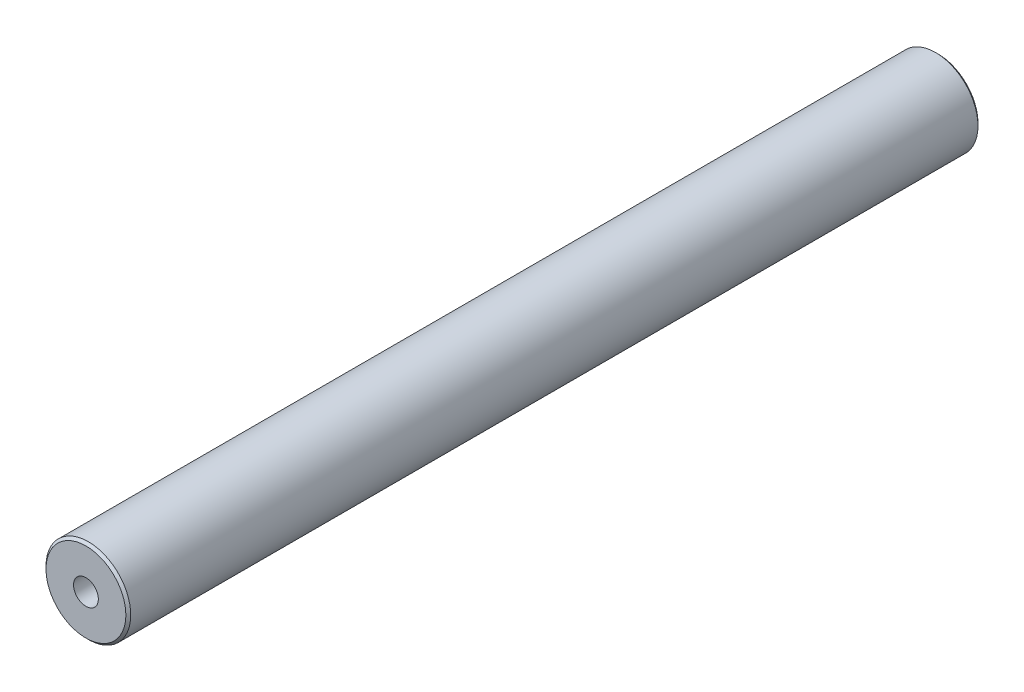
ISO-10303-21;
HEADER;
FILE_DESCRIPTION(('STEP AP214'),'2;1');
FILE_NAME('part.step','',(''),(''),'','','');
FILE_SCHEMA(('AUTOMOTIVE_DESIGN { 1 0 10303 214 1 1 1 1 }'));
ENDSEC;
DATA;
#1=APPLICATION_CONTEXT('core data for automotive mechanical design processes');
#2=APPLICATION_PROTOCOL_DEFINITION('international standard','automotive_design',2000,#1);
#3=PRODUCT_CONTEXT('',#1,'mechanical');
#4=PRODUCT('Part','Part','',(#3));
#5=PRODUCT_RELATED_PRODUCT_CATEGORY('part','',(#4));
#6=PRODUCT_DEFINITION_FORMATION('','',#4);
#7=PRODUCT_DEFINITION_CONTEXT('part definition',#1,'design');
#8=PRODUCT_DEFINITION('design','',#6,#7);
#9=PRODUCT_DEFINITION_SHAPE('','',#8);
#10=(LENGTH_UNIT() NAMED_UNIT(*) SI_UNIT(.MILLI.,.METRE.));
#11=(NAMED_UNIT(*) PLANE_ANGLE_UNIT() SI_UNIT($,.RADIAN.));
#12=(NAMED_UNIT(*) SI_UNIT($,.STERADIAN.) SOLID_ANGLE_UNIT());
#13=UNCERTAINTY_MEASURE_WITH_UNIT(LENGTH_MEASURE(1.E-05),#10,'distance_accuracy_value','');
#14=(GEOMETRIC_REPRESENTATION_CONTEXT(3) GLOBAL_UNCERTAINTY_ASSIGNED_CONTEXT((#13)) GLOBAL_UNIT_ASSIGNED_CONTEXT((#10,
#11,#12)) REPRESENTATION_CONTEXT('',''));
#15=CARTESIAN_POINT('',(0.,0.,0.));
#16=DIRECTION('',(0.,0.,1.));
#17=DIRECTION('',(1.,0.,0.));
#18=AXIS2_PLACEMENT_3D('',#15,#16,#17);
#19=CARTESIAN_POINT('',(-8.2984,-8.2984,87.5));
#20=DIRECTION('',(0.,0.,1.));
#21=DIRECTION('',(1.,0.,0.));
#22=AXIS2_PLACEMENT_3D('',#19,#20,#21);
#23=PLANE('',#22);
#24=CARTESIAN_POINT('',(0.,0.,87.5));
#25=DIRECTION('',(0.,0.,-1.));
#26=DIRECTION('',(0.,1.,0.));
#27=AXIS2_PLACEMENT_3D('',#24,#25,#26);
#28=CIRCLE('',#27,2.55);
#29=CARTESIAN_POINT('',(0.,2.55,87.5));
#30=VERTEX_POINT('',#29);
#31=EDGE_CURVE('E45',#30,#30,#28,.F.);
#32=ORIENTED_EDGE('',*,*,#31,.F.);
#33=EDGE_LOOP('',(#32));
#34=FACE_BOUND('',#33,.T.);
#35=CARTESIAN_POINT('',(0.,0.,87.4999999999999));
#36=DIRECTION('',(0.,0.,-1.));
#37=DIRECTION('',(0.,1.,0.));
#38=AXIS2_PLACEMENT_3D('',#35,#36,#37);
#39=CIRCLE('',#38,8.2000000000001);
#40=CARTESIAN_POINT('',(0.,8.2000000000001,87.4999999999999));
#41=VERTEX_POINT('',#40);
#42=EDGE_CURVE('E19',#41,#41,#39,.F.);
#43=ORIENTED_EDGE('',*,*,#42,.T.);
#44=EDGE_LOOP('',(#43));
#45=FACE_BOUND('',#44,.T.);
#46=ADVANCED_FACE('F15',(#34,#45),#23,.T.);
#47=CARTESIAN_POINT('',(0.,0.,87.5));
#48=DIRECTION('',(0.,0.,-1.));
#49=DIRECTION('',(0.,1.,0.));
#50=AXIS2_PLACEMENT_3D('',#47,#48,#49);
#51=CONICAL_SURFACE('',#50,8.2,0.785398163397448);
#52=ORIENTED_EDGE('',*,*,#42,.F.);
#53=EDGE_LOOP('',(#52));
#54=FACE_BOUND('',#53,.T.);
#55=CARTESIAN_POINT('',(0.,0.,87.));
#56=DIRECTION('',(0.,0.,-1.));
#57=DIRECTION('',(-1.,0.,0.));
#58=AXIS2_PLACEMENT_3D('',#55,#56,#57);
#59=CIRCLE('',#58,8.7);
#60=CARTESIAN_POINT('',(-8.7,0.,87.));
#61=VERTEX_POINT('',#60);
#62=EDGE_CURVE('E31',#61,#61,#59,.F.);
#63=ORIENTED_EDGE('',*,*,#62,.T.);
#64=EDGE_LOOP('',(#63));
#65=FACE_BOUND('',#64,.T.);
#66=ADVANCED_FACE('F54',(#54,#65),#51,.T.);
#67=CARTESIAN_POINT('',(0.,0.,87.5));
#68=DIRECTION('',(0.,0.,-1.));
#69=DIRECTION('',(0.,1.,0.));
#70=AXIS2_PLACEMENT_3D('',#67,#68,#69);
#71=CYLINDRICAL_SURFACE('',#70,2.55);
#72=ORIENTED_EDGE('',*,*,#31,.T.);
#73=EDGE_LOOP('',(#72));
#74=FACE_BOUND('',#73,.T.);
#75=CARTESIAN_POINT('',(0.,0.,77.5));
#76=DIRECTION('',(0.,0.,-1.));
#77=DIRECTION('',(0.,1.,0.));
#78=AXIS2_PLACEMENT_3D('',#75,#76,#77);
#79=CIRCLE('',#78,2.55);
#80=CARTESIAN_POINT('',(0.,2.54999999999997,77.5));
#81=VERTEX_POINT('',#80);
#82=EDGE_CURVE('E43',#81,#81,#79,.T.);
#83=ORIENTED_EDGE('',*,*,#82,.T.);
#84=EDGE_LOOP('',(#83));
#85=FACE_BOUND('',#84,.T.);
#86=ADVANCED_FACE('F57',(#74,#85),#71,.F.);
#87=CARTESIAN_POINT('',(0.,0.,87.));
#88=DIRECTION('',(0.,0.,-1.));
#89=DIRECTION('',(-1.,0.,0.));
#90=AXIS2_PLACEMENT_3D('',#87,#88,#89);
#91=CYLINDRICAL_SURFACE('',#90,8.7);
#92=ORIENTED_EDGE('',*,*,#62,.F.);
#93=EDGE_LOOP('',(#92));
#94=FACE_BOUND('',#93,.T.);
#95=CARTESIAN_POINT('',(0.,0.,-87.));
#96=DIRECTION('',(0.,0.,1.));
#97=DIRECTION('',(1.,0.,0.));
#98=AXIS2_PLACEMENT_3D('',#95,#96,#97);
#99=CIRCLE('',#98,8.7);
#100=CARTESIAN_POINT('',(8.7,0.,-87.));
#101=VERTEX_POINT('',#100);
#102=EDGE_CURVE('E42',#101,#101,#99,.T.);
#103=ORIENTED_EDGE('',*,*,#102,.T.);
#104=EDGE_LOOP('',(#103));
#105=FACE_BOUND('',#104,.T.);
#106=ADVANCED_FACE('F61',(#94,#105),#91,.T.);
#107=CARTESIAN_POINT('',(-8.096,-8.096,77.5));
#108=DIRECTION('',(0.,0.,1.));
#109=DIRECTION('',(1.,0.,0.));
#110=AXIS2_PLACEMENT_3D('',#107,#108,#109);
#111=PLANE('',#110);
#112=ORIENTED_EDGE('',*,*,#82,.F.);
#113=EDGE_LOOP('',(#112));
#114=FACE_BOUND('',#113,.T.);
#115=CARTESIAN_POINT('',(0.,0.,77.5));
#116=DIRECTION('',(0.,0.,-1.));
#117=DIRECTION('',(-1.,0.,0.));
#118=AXIS2_PLACEMENT_3D('',#115,#116,#117);
#119=CIRCLE('',#118,8.);
#120=CARTESIAN_POINT('',(-8.,0.,77.5));
#121=VERTEX_POINT('',#120);
#122=EDGE_CURVE('E39',#121,#121,#119,.F.);
#123=ORIENTED_EDGE('',*,*,#122,.F.);
#124=EDGE_LOOP('',(#123));
#125=FACE_BOUND('',#124,.T.);
#126=ADVANCED_FACE('F64',(#114,#125),#111,.F.);
#127=CARTESIAN_POINT('',(0.,0.,-87.5));
#128=DIRECTION('',(0.,0.,1.));
#129=DIRECTION('',(0.,-1.,0.));
#130=AXIS2_PLACEMENT_3D('',#127,#128,#129);
#131=CONICAL_SURFACE('',#130,8.2,0.785398163397448);
#132=CARTESIAN_POINT('',(0.,0.,-87.4999999999999));
#133=DIRECTION('',(0.,0.,1.));
#134=DIRECTION('',(0.,-1.,0.));
#135=AXIS2_PLACEMENT_3D('',#132,#133,#134);
#136=CIRCLE('',#135,8.2000000000001);
#137=CARTESIAN_POINT('',(0.,-8.2000000000001,-87.4999999999999));
#138=VERTEX_POINT('',#137);
#139=EDGE_CURVE('E36',#138,#138,#136,.T.);
#140=ORIENTED_EDGE('',*,*,#139,.T.);
#141=EDGE_LOOP('',(#140));
#142=FACE_BOUND('',#141,.T.);
#143=ORIENTED_EDGE('',*,*,#102,.F.);
#144=EDGE_LOOP('',(#143));
#145=FACE_BOUND('',#144,.T.);
#146=ADVANCED_FACE('F69',(#142,#145),#131,.T.);
#147=CARTESIAN_POINT('',(0.,0.,77.5));
#148=DIRECTION('',(0.,0.,-1.));
#149=DIRECTION('',(-1.,0.,0.));
#150=AXIS2_PLACEMENT_3D('',#147,#148,#149);
#151=CYLINDRICAL_SURFACE('',#150,8.);
#152=CARTESIAN_POINT('',(0.,0.,-77.5));
#153=DIRECTION('',(0.,0.,-1.));
#154=DIRECTION('',(-1.,0.,0.));
#155=AXIS2_PLACEMENT_3D('',#152,#153,#154);
#156=CIRCLE('',#155,8.);
#157=CARTESIAN_POINT('',(-8.,0.,-77.5));
#158=VERTEX_POINT('',#157);
#159=EDGE_CURVE('E28',#158,#158,#156,.F.);
#160=ORIENTED_EDGE('',*,*,#159,.F.);
#161=EDGE_LOOP('',(#160));
#162=FACE_BOUND('',#161,.T.);
#163=ORIENTED_EDGE('',*,*,#122,.T.);
#164=EDGE_LOOP('',(#163));
#165=FACE_BOUND('',#164,.T.);
#166=ADVANCED_FACE('F71',(#162,#165),#151,.F.);
#167=CARTESIAN_POINT('',(-8.2984,-8.2984,-87.5));
#168=DIRECTION('',(0.,0.,1.));
#169=DIRECTION('',(1.,0.,0.));
#170=AXIS2_PLACEMENT_3D('',#167,#168,#169);
#171=PLANE('',#170);
#172=CARTESIAN_POINT('',(0.,0.,-87.5));
#173=DIRECTION('',(0.,0.,1.));
#174=DIRECTION('',(0.,-1.,0.));
#175=AXIS2_PLACEMENT_3D('',#172,#173,#174);
#176=CIRCLE('',#175,2.55);
#177=CARTESIAN_POINT('',(0.,-2.55,-87.5));
#178=VERTEX_POINT('',#177);
#179=EDGE_CURVE('E23',#178,#178,#176,.F.);
#180=ORIENTED_EDGE('',*,*,#179,.F.);
#181=EDGE_LOOP('',(#180));
#182=FACE_BOUND('',#181,.T.);
#183=ORIENTED_EDGE('',*,*,#139,.F.);
#184=EDGE_LOOP('',(#183));
#185=FACE_BOUND('',#184,.T.);
#186=ADVANCED_FACE('F79',(#182,#185),#171,.F.);
#187=CARTESIAN_POINT('',(-8.096,-8.096,-77.5));
#188=DIRECTION('',(0.,0.,1.));
#189=DIRECTION('',(1.,0.,0.));
#190=AXIS2_PLACEMENT_3D('',#187,#188,#189);
#191=PLANE('',#190);
#192=CARTESIAN_POINT('',(0.,0.,-77.5));
#193=DIRECTION('',(0.,0.,1.));
#194=DIRECTION('',(0.,-1.,0.));
#195=AXIS2_PLACEMENT_3D('',#192,#193,#194);
#196=CIRCLE('',#195,2.55);
#197=CARTESIAN_POINT('',(0.,-2.55000000000003,-77.5));
#198=VERTEX_POINT('',#197);
#199=EDGE_CURVE('E10',#198,#198,#196,.T.);
#200=ORIENTED_EDGE('',*,*,#199,.F.);
#201=EDGE_LOOP('',(#200));
#202=FACE_BOUND('',#201,.T.);
#203=ORIENTED_EDGE('',*,*,#159,.T.);
#204=EDGE_LOOP('',(#203));
#205=FACE_BOUND('',#204,.T.);
#206=ADVANCED_FACE('F17',(#202,#205),#191,.T.);
#207=CARTESIAN_POINT('',(0.,0.,-87.5));
#208=DIRECTION('',(0.,0.,1.));
#209=DIRECTION('',(0.,-1.,0.));
#210=AXIS2_PLACEMENT_3D('',#207,#208,#209);
#211=CYLINDRICAL_SURFACE('',#210,2.55);
#212=ORIENTED_EDGE('',*,*,#199,.T.);
#213=EDGE_LOOP('',(#212));
#214=FACE_BOUND('',#213,.T.);
#215=ORIENTED_EDGE('',*,*,#179,.T.);
#216=EDGE_LOOP('',(#215));
#217=FACE_BOUND('',#216,.T.);
#218=ADVANCED_FACE('F84',(#214,#217),#211,.F.);
#219=CLOSED_SHELL('',(#46,#66,#86,#106,#126,#146,#166,#186,#206,#218));
#220=MANIFOLD_SOLID_BREP('B1',#219);
#221=ADVANCED_BREP_SHAPE_REPRESENTATION('',(#18,#220),#14);
#222=SHAPE_DEFINITION_REPRESENTATION(#9,#221);
ENDSEC;
END-ISO-10303-21;
